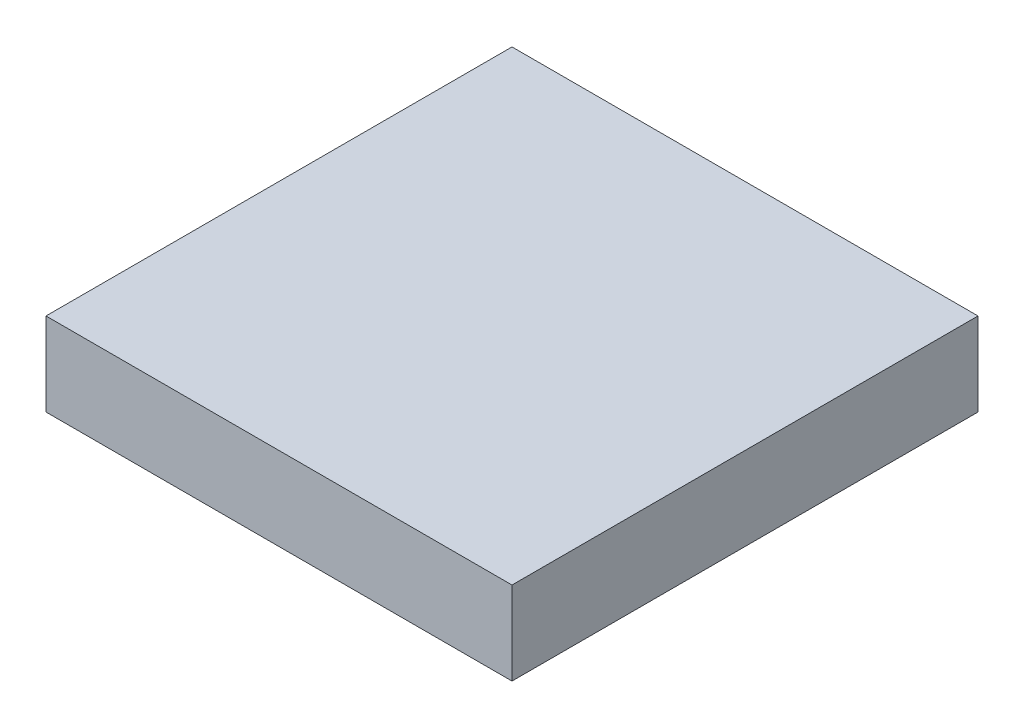
ISO-10303-21;
HEADER;
FILE_DESCRIPTION(('STEP AP214'),'2;1');
FILE_NAME('part.step','',(''),(''),'','','');
FILE_SCHEMA(('AUTOMOTIVE_DESIGN { 1 0 10303 214 1 1 1 1 }'));
ENDSEC;
DATA;
#1=APPLICATION_CONTEXT('core data for automotive mechanical design processes');
#2=APPLICATION_PROTOCOL_DEFINITION('international standard','automotive_design',2000,#1);
#3=PRODUCT_CONTEXT('',#1,'mechanical');
#4=PRODUCT('Part','Part','',(#3));
#5=PRODUCT_RELATED_PRODUCT_CATEGORY('part','',(#4));
#6=PRODUCT_DEFINITION_FORMATION('','',#4);
#7=PRODUCT_DEFINITION_CONTEXT('part definition',#1,'design');
#8=PRODUCT_DEFINITION('design','',#6,#7);
#9=PRODUCT_DEFINITION_SHAPE('','',#8);
#10=(LENGTH_UNIT() NAMED_UNIT(*) SI_UNIT(.MILLI.,.METRE.));
#11=(NAMED_UNIT(*) PLANE_ANGLE_UNIT() SI_UNIT($,.RADIAN.));
#12=(NAMED_UNIT(*) SI_UNIT($,.STERADIAN.) SOLID_ANGLE_UNIT());
#13=UNCERTAINTY_MEASURE_WITH_UNIT(LENGTH_MEASURE(1.E-05),#10,'distance_accuracy_value','');
#14=(GEOMETRIC_REPRESENTATION_CONTEXT(3) GLOBAL_UNCERTAINTY_ASSIGNED_CONTEXT((#13)) GLOBAL_UNIT_ASSIGNED_CONTEXT((#10,
#11,#12)) REPRESENTATION_CONTEXT('',''));
#15=CARTESIAN_POINT('',(0.,0.,0.));
#16=DIRECTION('',(0.,0.,1.));
#17=DIRECTION('',(1.,0.,0.));
#18=AXIS2_PLACEMENT_3D('',#15,#16,#17);
#19=CARTESIAN_POINT('',(-355.6,127.,-355.6));
#20=DIRECTION('',(1.,0.,0.));
#21=DIRECTION('',(0.,0.,-1.));
#22=AXIS2_PLACEMENT_3D('',#19,#20,#21);
#23=PLANE('',#22);
#24=DIRECTION('',(0.,0.,1.));
#25=VECTOR('',#24,1.);
#26=CARTESIAN_POINT('',(-355.6,0.,-355.6));
#27=LINE('',#26,#25);
#28=CARTESIAN_POINT('',(-355.6,0.,-355.6));
#29=VERTEX_POINT('',#28);
#30=CARTESIAN_POINT('',(-355.6,0.,355.6));
#31=VERTEX_POINT('',#30);
#32=EDGE_CURVE('E111',#29,#31,#27,.T.);
#33=ORIENTED_EDGE('',*,*,#32,.T.);
#34=DIRECTION('',(0.,-1.,0.));
#35=VECTOR('',#34,1.);
#36=CARTESIAN_POINT('',(-355.6,127.,355.6));
#37=LINE('',#36,#35);
#38=CARTESIAN_POINT('',(-355.6,127.,355.6));
#39=VERTEX_POINT('',#38);
#40=EDGE_CURVE('E11',#39,#31,#37,.T.);
#41=ORIENTED_EDGE('',*,*,#40,.F.);
#42=DIRECTION('',(0.,0.,1.));
#43=VECTOR('',#42,1.);
#44=CARTESIAN_POINT('',(-355.6,127.,-355.6));
#45=LINE('',#44,#43);
#46=CARTESIAN_POINT('',(-355.6,127.,-355.6));
#47=VERTEX_POINT('',#46);
#48=EDGE_CURVE('E95',#47,#39,#45,.T.);
#49=ORIENTED_EDGE('',*,*,#48,.F.);
#50=DIRECTION('',(0.,-1.,0.));
#51=VECTOR('',#50,1.);
#52=CARTESIAN_POINT('',(-355.6,127.,-355.6));
#53=LINE('',#52,#51);
#54=EDGE_CURVE('E107',#47,#29,#53,.T.);
#55=ORIENTED_EDGE('',*,*,#54,.T.);
#56=EDGE_LOOP('',(#33,#41,#49,#55));
#57=FACE_BOUND('',#56,.T.);
#58=ADVANCED_FACE('F43',(#57),#23,.F.);
#59=CARTESIAN_POINT('',(355.6,127.,355.6));
#60=DIRECTION('',(0.,0.,-1.));
#61=DIRECTION('',(-1.,0.,0.));
#62=AXIS2_PLACEMENT_3D('',#59,#60,#61);
#63=PLANE('',#62);
#64=DIRECTION('',(1.,0.,0.));
#65=VECTOR('',#64,1.);
#66=CARTESIAN_POINT('',(355.6,0.,355.6));
#67=LINE('',#66,#65);
#68=CARTESIAN_POINT('',(355.6,0.,355.6));
#69=VERTEX_POINT('',#68);
#70=EDGE_CURVE('E100',#31,#69,#67,.T.);
#71=ORIENTED_EDGE('',*,*,#70,.T.);
#72=DIRECTION('',(0.,-1.,0.));
#73=VECTOR('',#72,1.);
#74=CARTESIAN_POINT('',(355.6,127.,355.6));
#75=LINE('',#74,#73);
#76=CARTESIAN_POINT('',(355.6,127.,355.6));
#77=VERTEX_POINT('',#76);
#78=EDGE_CURVE('E52',#77,#69,#75,.T.);
#79=ORIENTED_EDGE('',*,*,#78,.F.);
#80=DIRECTION('',(1.,0.,0.));
#81=VECTOR('',#80,1.);
#82=CARTESIAN_POINT('',(355.6,127.,355.6));
#83=LINE('',#82,#81);
#84=EDGE_CURVE('E90',#39,#77,#83,.T.);
#85=ORIENTED_EDGE('',*,*,#84,.F.);
#86=ORIENTED_EDGE('',*,*,#40,.T.);
#87=EDGE_LOOP('',(#71,#79,#85,#86));
#88=FACE_BOUND('',#87,.T.);
#89=ADVANCED_FACE('F99',(#88),#63,.F.);
#90=CARTESIAN_POINT('',(355.6,127.,-355.6));
#91=DIRECTION('',(-1.,0.,0.));
#92=DIRECTION('',(0.,0.,1.));
#93=AXIS2_PLACEMENT_3D('',#90,#91,#92);
#94=PLANE('',#93);
#95=DIRECTION('',(0.,0.,-1.));
#96=VECTOR('',#95,1.);
#97=CARTESIAN_POINT('',(355.6,0.,-355.6));
#98=LINE('',#97,#96);
#99=CARTESIAN_POINT('',(355.6,0.,-355.6));
#100=VERTEX_POINT('',#99);
#101=EDGE_CURVE('E77',#69,#100,#98,.T.);
#102=ORIENTED_EDGE('',*,*,#101,.T.);
#103=DIRECTION('',(0.,-1.,0.));
#104=VECTOR('',#103,1.);
#105=CARTESIAN_POINT('',(355.6,127.,-355.6));
#106=LINE('',#105,#104);
#107=CARTESIAN_POINT('',(355.6,127.,-355.6));
#108=VERTEX_POINT('',#107);
#109=EDGE_CURVE('E102',#108,#100,#106,.T.);
#110=ORIENTED_EDGE('',*,*,#109,.F.);
#111=DIRECTION('',(0.,0.,-1.));
#112=VECTOR('',#111,1.);
#113=CARTESIAN_POINT('',(355.6,127.,-355.6));
#114=LINE('',#113,#112);
#115=EDGE_CURVE('E93',#77,#108,#114,.T.);
#116=ORIENTED_EDGE('',*,*,#115,.F.);
#117=ORIENTED_EDGE('',*,*,#78,.T.);
#118=EDGE_LOOP('',(#102,#110,#116,#117));
#119=FACE_BOUND('',#118,.T.);
#120=ADVANCED_FACE('F103',(#119),#94,.F.);
#121=CARTESIAN_POINT('',(355.6,127.,-355.6));
#122=DIRECTION('',(0.,0.,1.));
#123=DIRECTION('',(1.,0.,0.));
#124=AXIS2_PLACEMENT_3D('',#121,#122,#123);
#125=PLANE('',#124);
#126=DIRECTION('',(-1.,0.,0.));
#127=VECTOR('',#126,1.);
#128=CARTESIAN_POINT('',(355.6,0.,-355.6));
#129=LINE('',#128,#127);
#130=EDGE_CURVE('E83',#100,#29,#129,.T.);
#131=ORIENTED_EDGE('',*,*,#130,.T.);
#132=ORIENTED_EDGE('',*,*,#54,.F.);
#133=DIRECTION('',(-1.,0.,0.));
#134=VECTOR('',#133,1.);
#135=CARTESIAN_POINT('',(355.6,127.,-355.6));
#136=LINE('',#135,#134);
#137=EDGE_CURVE('E60',#108,#47,#136,.T.);
#138=ORIENTED_EDGE('',*,*,#137,.F.);
#139=ORIENTED_EDGE('',*,*,#109,.T.);
#140=EDGE_LOOP('',(#131,#132,#138,#139));
#141=FACE_BOUND('',#140,.T.);
#142=ADVANCED_FACE('F124',(#141),#125,.F.);
#143=CARTESIAN_POINT('',(0.,127.,0.));
#144=DIRECTION('',(0.,-1.,0.));
#145=DIRECTION('',(0.,0.,-1.));
#146=AXIS2_PLACEMENT_3D('',#143,#144,#145);
#147=PLANE('',#146);
#148=ORIENTED_EDGE('',*,*,#48,.T.);
#149=ORIENTED_EDGE('',*,*,#84,.T.);
#150=ORIENTED_EDGE('',*,*,#115,.T.);
#151=ORIENTED_EDGE('',*,*,#137,.T.);
#152=EDGE_LOOP('',(#148,#149,#150,#151));
#153=FACE_BOUND('',#152,.T.);
#154=ADVANCED_FACE('F91',(#153),#147,.F.);
#155=CARTESIAN_POINT('',(0.,0.,0.));
#156=DIRECTION('',(0.,-1.,0.));
#157=DIRECTION('',(0.,0.,-1.));
#158=AXIS2_PLACEMENT_3D('',#155,#156,#157);
#159=PLANE('',#158);
#160=ORIENTED_EDGE('',*,*,#32,.F.);
#161=ORIENTED_EDGE('',*,*,#130,.F.);
#162=ORIENTED_EDGE('',*,*,#101,.F.);
#163=ORIENTED_EDGE('',*,*,#70,.F.);
#164=EDGE_LOOP('',(#160,#161,#162,#163));
#165=FACE_BOUND('',#164,.T.);
#166=ADVANCED_FACE('F127',(#165),#159,.T.);
#167=CLOSED_SHELL('',(#58,#89,#120,#142,#154,#166));
#168=MANIFOLD_SOLID_BREP('B2',#167);
#169=ADVANCED_BREP_SHAPE_REPRESENTATION('',(#18,#168),#14);
#170=SHAPE_DEFINITION_REPRESENTATION(#9,#169);
ENDSEC;
END-ISO-10303-21;
